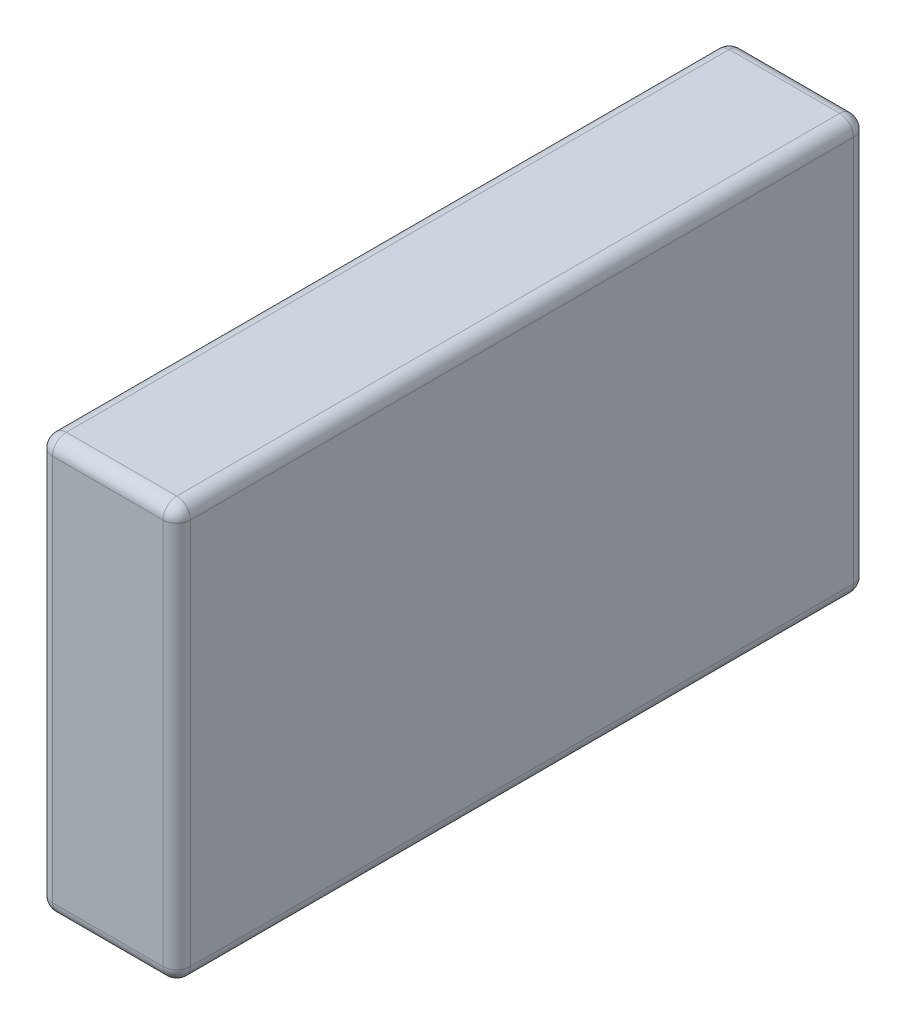
ISO-10303-21;
HEADER;
FILE_DESCRIPTION(('STEP AP214'),'2;1');
FILE_NAME('part.step','',(''),(''),'','','');
FILE_SCHEMA(('AUTOMOTIVE_DESIGN { 1 0 10303 214 1 1 1 1 }'));
ENDSEC;
DATA;
#1=APPLICATION_CONTEXT('core data for automotive mechanical design processes');
#2=APPLICATION_PROTOCOL_DEFINITION('international standard','automotive_design',2000,#1);
#3=PRODUCT_CONTEXT('',#1,'mechanical');
#4=PRODUCT('Part','Part','',(#3));
#5=PRODUCT_RELATED_PRODUCT_CATEGORY('part','',(#4));
#6=PRODUCT_DEFINITION_FORMATION('','',#4);
#7=PRODUCT_DEFINITION_CONTEXT('part definition',#1,'design');
#8=PRODUCT_DEFINITION('design','',#6,#7);
#9=PRODUCT_DEFINITION_SHAPE('','',#8);
#10=(LENGTH_UNIT() NAMED_UNIT(*) SI_UNIT(.MILLI.,.METRE.));
#11=(NAMED_UNIT(*) PLANE_ANGLE_UNIT() SI_UNIT($,.RADIAN.));
#12=(NAMED_UNIT(*) SI_UNIT($,.STERADIAN.) SOLID_ANGLE_UNIT());
#13=UNCERTAINTY_MEASURE_WITH_UNIT(LENGTH_MEASURE(1.E-05),#10,'distance_accuracy_value','');
#14=(GEOMETRIC_REPRESENTATION_CONTEXT(3) GLOBAL_UNCERTAINTY_ASSIGNED_CONTEXT((#13)) GLOBAL_UNIT_ASSIGNED_CONTEXT((#10,
#11,#12)) REPRESENTATION_CONTEXT('',''));
#15=CARTESIAN_POINT('',(0.,0.,0.));
#16=DIRECTION('',(0.,0.,1.));
#17=DIRECTION('',(1.,0.,0.));
#18=AXIS2_PLACEMENT_3D('',#15,#16,#17);
#19=CARTESIAN_POINT('',(-4.69017094017094,2.05128205128205,50.));
#20=DIRECTION('',(1.,0.,0.));
#21=DIRECTION('',(0.,1.,0.));
#22=AXIS2_PLACEMENT_3D('',#19,#20,#21);
#23=PLANE('',#22);
#24=DIRECTION('',(0.,0.,-1.));
#25=VECTOR('',#24,1.);
#26=CARTESIAN_POINT('',(-4.69017094017094,-26.9487179487179,50.));
#27=LINE('',#26,#25);
#28=CARTESIAN_POINT('',(-4.69017094017094,-26.9487179487179,1.));
#29=VERTEX_POINT('',#28);
#30=CARTESIAN_POINT('',(-4.69017094017094,-26.9487179487179,49.));
#31=VERTEX_POINT('',#30);
#32=EDGE_CURVE('E261',#29,#31,#27,.F.);
#33=ORIENTED_EDGE('',*,*,#32,.T.);
#34=DIRECTION('',(0.,-1.,0.));
#35=VECTOR('',#34,1.);
#36=CARTESIAN_POINT('',(-4.69017094017094,2.05128205128205,49.));
#37=LINE('',#36,#35);
#38=CARTESIAN_POINT('',(-4.69017094017094,1.05128205128205,49.));
#39=VERTEX_POINT('',#38);
#40=EDGE_CURVE('E259',#31,#39,#37,.F.);
#41=ORIENTED_EDGE('',*,*,#40,.T.);
#42=DIRECTION('',(0.,0.,-1.));
#43=VECTOR('',#42,1.);
#44=CARTESIAN_POINT('',(-4.69017094017094,1.05128205128205,50.));
#45=LINE('',#44,#43);
#46=CARTESIAN_POINT('',(-4.69017094017094,1.05128205128205,1.));
#47=VERTEX_POINT('',#46);
#48=EDGE_CURVE('E251',#39,#47,#45,.T.);
#49=ORIENTED_EDGE('',*,*,#48,.T.);
#50=DIRECTION('',(0.,-1.,0.));
#51=VECTOR('',#50,1.);
#52=CARTESIAN_POINT('',(-4.69017094017094,2.05128205128205,1.));
#53=LINE('',#52,#51);
#54=EDGE_CURVE('E256',#47,#29,#53,.T.);
#55=ORIENTED_EDGE('',*,*,#54,.T.);
#56=EDGE_LOOP('',(#33,#41,#49,#55));
#57=FACE_BOUND('',#56,.T.);
#58=ADVANCED_FACE('F32',(#57),#23,.F.);
#59=CARTESIAN_POINT('',(-4.69017094017094,-27.9487179487179,50.));
#60=DIRECTION('',(0.,1.,0.));
#61=DIRECTION('',(0.,0.,1.));
#62=AXIS2_PLACEMENT_3D('',#59,#60,#61);
#63=PLANE('',#62);
#64=DIRECTION('',(1.,0.,0.));
#65=VECTOR('',#64,1.);
#66=CARTESIAN_POINT('',(-4.69017094017094,-27.9487179487179,49.));
#67=LINE('',#66,#65);
#68=CARTESIAN_POINT('',(4.30982905982906,-27.9487179487179,49.));
#69=VERTEX_POINT('',#68);
#70=CARTESIAN_POINT('',(-3.69017094017094,-27.9487179487179,49.));
#71=VERTEX_POINT('',#70);
#72=EDGE_CURVE('E155',#69,#71,#67,.F.);
#73=ORIENTED_EDGE('',*,*,#72,.T.);
#74=DIRECTION('',(0.,0.,-1.));
#75=VECTOR('',#74,1.);
#76=CARTESIAN_POINT('',(-3.69017094017094,-27.9487179487179,50.));
#77=LINE('',#76,#75);
#78=CARTESIAN_POINT('',(-3.69017094017094,-27.9487179487179,1.));
#79=VERTEX_POINT('',#78);
#80=EDGE_CURVE('E274',#71,#79,#77,.T.);
#81=ORIENTED_EDGE('',*,*,#80,.T.);
#82=DIRECTION('',(1.,0.,0.));
#83=VECTOR('',#82,1.);
#84=CARTESIAN_POINT('',(-4.69017094017094,-27.9487179487179,1.));
#85=LINE('',#84,#83);
#86=CARTESIAN_POINT('',(4.30982905982906,-27.9487179487179,1.));
#87=VERTEX_POINT('',#86);
#88=EDGE_CURVE('E267',#79,#87,#85,.T.);
#89=ORIENTED_EDGE('',*,*,#88,.T.);
#90=DIRECTION('',(0.,0.,-1.));
#91=VECTOR('',#90,1.);
#92=CARTESIAN_POINT('',(4.30982905982906,-27.9487179487179,50.));
#93=LINE('',#92,#91);
#94=EDGE_CURVE('E265',#87,#69,#93,.F.);
#95=ORIENTED_EDGE('',*,*,#94,.T.);
#96=EDGE_LOOP('',(#73,#81,#89,#95));
#97=FACE_BOUND('',#96,.T.);
#98=ADVANCED_FACE('F316',(#97),#63,.F.);
#99=CARTESIAN_POINT('',(5.30982905982906,2.05128205128205,50.));
#100=DIRECTION('',(-1.,0.,0.));
#101=DIRECTION('',(0.,-1.,0.));
#102=AXIS2_PLACEMENT_3D('',#99,#100,#101);
#103=PLANE('',#102);
#104=DIRECTION('',(0.,1.,0.));
#105=VECTOR('',#104,1.);
#106=CARTESIAN_POINT('',(5.30982905982906,-27.9487179487179,49.));
#107=LINE('',#106,#105);
#108=CARTESIAN_POINT('',(5.30982905982906,1.05128205128205,49.));
#109=VERTEX_POINT('',#108);
#110=CARTESIAN_POINT('',(5.30982905982906,-26.9487179487179,49.));
#111=VERTEX_POINT('',#110);
#112=EDGE_CURVE('E56',#109,#111,#107,.F.);
#113=ORIENTED_EDGE('',*,*,#112,.T.);
#114=DIRECTION('',(0.,0.,-1.));
#115=VECTOR('',#114,1.);
#116=CARTESIAN_POINT('',(5.30982905982906,-26.9487179487179,50.));
#117=LINE('',#116,#115);
#118=CARTESIAN_POINT('',(5.30982905982906,-26.9487179487179,1.));
#119=VERTEX_POINT('',#118);
#120=EDGE_CURVE('E11',#111,#119,#117,.T.);
#121=ORIENTED_EDGE('',*,*,#120,.T.);
#122=DIRECTION('',(0.,1.,0.));
#123=VECTOR('',#122,1.);
#124=CARTESIAN_POINT('',(5.30982905982906,2.05128205128205,1.));
#125=LINE('',#124,#123);
#126=CARTESIAN_POINT('',(5.30982905982906,1.05128205128205,1.));
#127=VERTEX_POINT('',#126);
#128=EDGE_CURVE('E41',#119,#127,#125,.T.);
#129=ORIENTED_EDGE('',*,*,#128,.T.);
#130=DIRECTION('',(0.,0.,-1.));
#131=VECTOR('',#130,1.);
#132=CARTESIAN_POINT('',(5.30982905982906,1.05128205128205,50.));
#133=LINE('',#132,#131);
#134=EDGE_CURVE('E221',#127,#109,#133,.F.);
#135=ORIENTED_EDGE('',*,*,#134,.T.);
#136=EDGE_LOOP('',(#113,#121,#129,#135));
#137=FACE_BOUND('',#136,.T.);
#138=ADVANCED_FACE('F288',(#137),#103,.F.);
#139=CARTESIAN_POINT('',(-4.69017094017094,2.05128205128205,50.));
#140=DIRECTION('',(0.,-1.,0.));
#141=DIRECTION('',(0.,0.,-1.));
#142=AXIS2_PLACEMENT_3D('',#139,#140,#141);
#143=PLANE('',#142);
#144=DIRECTION('',(-1.,0.,0.));
#145=VECTOR('',#144,1.);
#146=CARTESIAN_POINT('',(-4.69017094017094,2.05128205128205,1.));
#147=LINE('',#146,#145);
#148=CARTESIAN_POINT('',(4.30982905982906,2.05128205128205,1.));
#149=VERTEX_POINT('',#148);
#150=CARTESIAN_POINT('',(-3.69017094017094,2.05128205128205,1.));
#151=VERTEX_POINT('',#150);
#152=EDGE_CURVE('E214',#149,#151,#147,.T.);
#153=ORIENTED_EDGE('',*,*,#152,.T.);
#154=DIRECTION('',(0.,0.,-1.));
#155=VECTOR('',#154,1.);
#156=CARTESIAN_POINT('',(-3.69017094017094,2.05128205128205,50.));
#157=LINE('',#156,#155);
#158=CARTESIAN_POINT('',(-3.69017094017094,2.05128205128205,49.));
#159=VERTEX_POINT('',#158);
#160=EDGE_CURVE('E218',#151,#159,#157,.F.);
#161=ORIENTED_EDGE('',*,*,#160,.T.);
#162=DIRECTION('',(-1.,0.,0.));
#163=VECTOR('',#162,1.);
#164=CARTESIAN_POINT('',(5.30982905982906,2.05128205128205,49.));
#165=LINE('',#164,#163);
#166=CARTESIAN_POINT('',(4.30982905982906,2.05128205128205,49.));
#167=VERTEX_POINT('',#166);
#168=EDGE_CURVE('E219',#159,#167,#165,.F.);
#169=ORIENTED_EDGE('',*,*,#168,.T.);
#170=DIRECTION('',(0.,0.,-1.));
#171=VECTOR('',#170,1.);
#172=CARTESIAN_POINT('',(4.30982905982906,2.05128205128205,50.));
#173=LINE('',#172,#171);
#174=EDGE_CURVE('E223',#167,#149,#173,.T.);
#175=ORIENTED_EDGE('',*,*,#174,.T.);
#176=EDGE_LOOP('',(#153,#161,#169,#175));
#177=FACE_BOUND('',#176,.T.);
#178=ADVANCED_FACE('F284',(#177),#143,.F.);
#179=CARTESIAN_POINT('',(0.,0.,50.));
#180=DIRECTION('',(0.,0.,1.));
#181=DIRECTION('',(1.,0.,0.));
#182=AXIS2_PLACEMENT_3D('',#179,#180,#181);
#183=PLANE('',#182);
#184=DIRECTION('',(-1.,0.,0.));
#185=VECTOR('',#184,1.);
#186=CARTESIAN_POINT('',(-4.69017094017094,1.05128205128205,50.));
#187=LINE('',#186,#185);
#188=CARTESIAN_POINT('',(4.30982905982906,1.05128205128205,50.));
#189=VERTEX_POINT('',#188);
#190=CARTESIAN_POINT('',(-3.69017094017094,1.05128205128205,50.));
#191=VERTEX_POINT('',#190);
#192=EDGE_CURVE('E134',#189,#191,#187,.T.);
#193=ORIENTED_EDGE('',*,*,#192,.T.);
#194=DIRECTION('',(0.,-1.,0.));
#195=VECTOR('',#194,1.);
#196=CARTESIAN_POINT('',(-3.69017094017094,-27.9487179487179,50.));
#197=LINE('',#196,#195);
#198=CARTESIAN_POINT('',(-3.69017094017094,-26.9487179487179,50.));
#199=VERTEX_POINT('',#198);
#200=EDGE_CURVE('E130',#191,#199,#197,.T.);
#201=ORIENTED_EDGE('',*,*,#200,.T.);
#202=DIRECTION('',(1.,0.,0.));
#203=VECTOR('',#202,1.);
#204=CARTESIAN_POINT('',(5.30982905982906,-26.9487179487179,50.));
#205=LINE('',#204,#203);
#206=CARTESIAN_POINT('',(4.30982905982906,-26.9487179487179,50.));
#207=VERTEX_POINT('',#206);
#208=EDGE_CURVE('E124',#199,#207,#205,.T.);
#209=ORIENTED_EDGE('',*,*,#208,.T.);
#210=DIRECTION('',(0.,1.,0.));
#211=VECTOR('',#210,1.);
#212=CARTESIAN_POINT('',(4.30982905982906,2.05128205128205,50.));
#213=LINE('',#212,#211);
#214=EDGE_CURVE('E127',#207,#189,#213,.T.);
#215=ORIENTED_EDGE('',*,*,#214,.T.);
#216=EDGE_LOOP('',(#193,#201,#209,#215));
#217=FACE_BOUND('',#216,.T.);
#218=ADVANCED_FACE('F126',(#217),#183,.T.);
#219=CARTESIAN_POINT('',(0.,0.,0.));
#220=DIRECTION('',(0.,0.,1.));
#221=DIRECTION('',(1.,0.,0.));
#222=AXIS2_PLACEMENT_3D('',#219,#220,#221);
#223=PLANE('',#222);
#224=DIRECTION('',(1.,0.,0.));
#225=VECTOR('',#224,1.);
#226=CARTESIAN_POINT('',(0.,-26.9487179487179,0.));
#227=LINE('',#226,#225);
#228=CARTESIAN_POINT('',(4.30982905982906,-26.9487179487179,0.));
#229=VERTEX_POINT('',#228);
#230=CARTESIAN_POINT('',(-3.69017094017094,-26.9487179487179,0.));
#231=VERTEX_POINT('',#230);
#232=EDGE_CURVE('E279',#229,#231,#227,.F.);
#233=ORIENTED_EDGE('',*,*,#232,.T.);
#234=DIRECTION('',(0.,-1.,0.));
#235=VECTOR('',#234,1.);
#236=CARTESIAN_POINT('',(-3.69017094017094,0.,0.));
#237=LINE('',#236,#235);
#238=CARTESIAN_POINT('',(-3.69017094017094,1.05128205128205,0.));
#239=VERTEX_POINT('',#238);
#240=EDGE_CURVE('E282',#231,#239,#237,.F.);
#241=ORIENTED_EDGE('',*,*,#240,.T.);
#242=DIRECTION('',(-1.,0.,0.));
#243=VECTOR('',#242,1.);
#244=CARTESIAN_POINT('',(0.,1.05128205128205,0.));
#245=LINE('',#244,#243);
#246=CARTESIAN_POINT('',(4.30982905982906,1.05128205128205,0.));
#247=VERTEX_POINT('',#246);
#248=EDGE_CURVE('E212',#239,#247,#245,.F.);
#249=ORIENTED_EDGE('',*,*,#248,.T.);
#250=DIRECTION('',(0.,1.,0.));
#251=VECTOR('',#250,1.);
#252=CARTESIAN_POINT('',(4.30982905982906,0.,0.));
#253=LINE('',#252,#251);
#254=EDGE_CURVE('E277',#247,#229,#253,.F.);
#255=ORIENTED_EDGE('',*,*,#254,.T.);
#256=EDGE_LOOP('',(#233,#241,#249,#255));
#257=FACE_BOUND('',#256,.T.);
#258=ADVANCED_FACE('F297',(#257),#223,.F.);
#259=CARTESIAN_POINT('',(4.30982905982906,2.05128205128205,1.));
#260=DIRECTION('',(0.,1.,0.));
#261=DIRECTION('',(-1.,0.,0.));
#262=AXIS2_PLACEMENT_3D('',#259,#260,#261);
#263=CYLINDRICAL_SURFACE('',#262,1.);
#264=CARTESIAN_POINT('',(4.30982905982906,1.05128205128205,1.));
#265=DIRECTION('',(0.,1.,0.));
#266=DIRECTION('',(0.,0.,1.));
#267=AXIS2_PLACEMENT_3D('',#264,#265,#266);
#268=CIRCLE('',#267,1.);
#269=EDGE_CURVE('E36',#127,#247,#268,.T.);
#270=ORIENTED_EDGE('',*,*,#269,.F.);
#271=ORIENTED_EDGE('',*,*,#128,.F.);
#272=CARTESIAN_POINT('',(4.30982905982906,-26.9487179487179,1.));
#273=DIRECTION('',(0.,-1.,0.));
#274=DIRECTION('',(0.,0.,-1.));
#275=AXIS2_PLACEMENT_3D('',#272,#273,#274);
#276=CIRCLE('',#275,1.);
#277=EDGE_CURVE('E193',#229,#119,#276,.T.);
#278=ORIENTED_EDGE('',*,*,#277,.F.);
#279=ORIENTED_EDGE('',*,*,#254,.F.);
#280=EDGE_LOOP('',(#270,#271,#278,#279));
#281=FACE_BOUND('',#280,.T.);
#282=ADVANCED_FACE('F34',(#281),#263,.T.);
#283=CARTESIAN_POINT('',(4.30982905982906,1.05128205128205,1.));
#284=DIRECTION('',(0.,0.,1.));
#285=DIRECTION('',(1.,0.,0.));
#286=AXIS2_PLACEMENT_3D('',#283,#284,#285);
#287=SPHERICAL_SURFACE('',#286,1.);
#288=CARTESIAN_POINT('',(4.30982905982906,1.05128205128205,1.));
#289=DIRECTION('',(0.,0.,-1.));
#290=DIRECTION('',(-1.,0.,0.));
#291=AXIS2_PLACEMENT_3D('',#288,#289,#290);
#292=CIRCLE('',#291,1.);
#293=EDGE_CURVE('E188',#127,#149,#292,.F.);
#294=ORIENTED_EDGE('',*,*,#293,.F.);
#295=ORIENTED_EDGE('',*,*,#269,.T.);
#296=CARTESIAN_POINT('',(4.30982905982906,1.05128205128205,1.));
#297=DIRECTION('',(1.,0.,0.));
#298=DIRECTION('',(0.,1.,0.));
#299=AXIS2_PLACEMENT_3D('',#296,#297,#298);
#300=CIRCLE('',#299,1.);
#301=EDGE_CURVE('E191',#149,#247,#300,.F.);
#302=ORIENTED_EDGE('',*,*,#301,.F.);
#303=EDGE_LOOP('',(#294,#295,#302));
#304=FACE_BOUND('',#303,.T.);
#305=ADVANCED_FACE('F203',(#304),#287,.T.);
#306=CARTESIAN_POINT('',(4.30982905982906,-26.9487179487179,1.));
#307=DIRECTION('',(0.,0.,1.));
#308=DIRECTION('',(1.,0.,0.));
#309=AXIS2_PLACEMENT_3D('',#306,#307,#308);
#310=SPHERICAL_SURFACE('',#309,1.);
#311=CARTESIAN_POINT('',(4.30982905982906,-26.9487179487179,1.));
#312=DIRECTION('',(1.,0.,0.));
#313=DIRECTION('',(0.,0.,-1.));
#314=AXIS2_PLACEMENT_3D('',#311,#312,#313);
#315=CIRCLE('',#314,1.);
#316=EDGE_CURVE('E184',#229,#87,#315,.F.);
#317=ORIENTED_EDGE('',*,*,#316,.F.);
#318=ORIENTED_EDGE('',*,*,#277,.T.);
#319=CARTESIAN_POINT('',(4.30982905982906,-26.9487179487179,1.));
#320=DIRECTION('',(0.,0.,-1.));
#321=DIRECTION('',(-1.,0.,0.));
#322=AXIS2_PLACEMENT_3D('',#319,#320,#321);
#323=CIRCLE('',#322,1.);
#324=EDGE_CURVE('E49',#87,#119,#323,.F.);
#325=ORIENTED_EDGE('',*,*,#324,.F.);
#326=EDGE_LOOP('',(#317,#318,#325));
#327=FACE_BOUND('',#326,.T.);
#328=ADVANCED_FACE('F290',(#327),#310,.T.);
#329=CARTESIAN_POINT('',(-4.69017094017094,1.05128205128205,1.));
#330=DIRECTION('',(-1.,0.,0.));
#331=DIRECTION('',(0.,0.,1.));
#332=AXIS2_PLACEMENT_3D('',#329,#330,#331);
#333=CYLINDRICAL_SURFACE('',#332,1.);
#334=ORIENTED_EDGE('',*,*,#301,.T.);
#335=ORIENTED_EDGE('',*,*,#248,.F.);
#336=CARTESIAN_POINT('',(-3.69017094017094,1.05128205128205,1.));
#337=DIRECTION('',(-1.,0.,0.));
#338=DIRECTION('',(0.,0.,1.));
#339=AXIS2_PLACEMENT_3D('',#336,#337,#338);
#340=CIRCLE('',#339,1.);
#341=EDGE_CURVE('E179',#151,#239,#340,.T.);
#342=ORIENTED_EDGE('',*,*,#341,.F.);
#343=ORIENTED_EDGE('',*,*,#152,.F.);
#344=EDGE_LOOP('',(#334,#335,#342,#343));
#345=FACE_BOUND('',#344,.T.);
#346=ADVANCED_FACE('F210',(#345),#333,.T.);
#347=CARTESIAN_POINT('',(4.30982905982906,1.05128205128205,50.));
#348=DIRECTION('',(0.,0.,-1.));
#349=DIRECTION('',(-1.,0.,0.));
#350=AXIS2_PLACEMENT_3D('',#347,#348,#349);
#351=CYLINDRICAL_SURFACE('',#350,1.);
#352=ORIENTED_EDGE('',*,*,#293,.T.);
#353=ORIENTED_EDGE('',*,*,#174,.F.);
#354=CARTESIAN_POINT('',(4.30982905982906,1.05128205128205,49.));
#355=DIRECTION('',(0.,0.,1.));
#356=DIRECTION('',(1.,0.,0.));
#357=AXIS2_PLACEMENT_3D('',#354,#355,#356);
#358=CIRCLE('',#357,1.);
#359=EDGE_CURVE('E176',#109,#167,#358,.T.);
#360=ORIENTED_EDGE('',*,*,#359,.F.);
#361=ORIENTED_EDGE('',*,*,#134,.F.);
#362=EDGE_LOOP('',(#352,#353,#360,#361));
#363=FACE_BOUND('',#362,.T.);
#364=ADVANCED_FACE('F287',(#363),#351,.T.);
#365=CARTESIAN_POINT('',(4.30982905982906,0.,49.));
#366=DIRECTION('',(0.,-1.,0.));
#367=DIRECTION('',(1.,0.,0.));
#368=AXIS2_PLACEMENT_3D('',#365,#366,#367);
#369=CYLINDRICAL_SURFACE('',#368,1.);
#370=CARTESIAN_POINT('',(4.30982905982906,-26.9487179487179,49.));
#371=DIRECTION('',(0.,-1.,0.));
#372=DIRECTION('',(0.,0.,-1.));
#373=AXIS2_PLACEMENT_3D('',#370,#371,#372);
#374=CIRCLE('',#373,1.);
#375=EDGE_CURVE('E140',#111,#207,#374,.T.);
#376=ORIENTED_EDGE('',*,*,#375,.F.);
#377=ORIENTED_EDGE('',*,*,#112,.F.);
#378=CARTESIAN_POINT('',(4.30982905982906,1.05128205128205,49.));
#379=DIRECTION('',(0.,1.,0.));
#380=DIRECTION('',(0.,0.,1.));
#381=AXIS2_PLACEMENT_3D('',#378,#379,#380);
#382=CIRCLE('',#381,1.);
#383=EDGE_CURVE('E143',#189,#109,#382,.T.);
#384=ORIENTED_EDGE('',*,*,#383,.F.);
#385=ORIENTED_EDGE('',*,*,#214,.F.);
#386=EDGE_LOOP('',(#376,#377,#384,#385));
#387=FACE_BOUND('',#386,.T.);
#388=ADVANCED_FACE('F139',(#387),#369,.T.);
#389=CARTESIAN_POINT('',(4.30982905982906,-26.9487179487179,50.));
#390=DIRECTION('',(0.,0.,-1.));
#391=DIRECTION('',(-1.,0.,0.));
#392=AXIS2_PLACEMENT_3D('',#389,#390,#391);
#393=CYLINDRICAL_SURFACE('',#392,1.);
#394=ORIENTED_EDGE('',*,*,#324,.T.);
#395=ORIENTED_EDGE('',*,*,#120,.F.);
#396=CARTESIAN_POINT('',(4.30982905982906,-26.9487179487179,49.));
#397=DIRECTION('',(0.,0.,1.));
#398=DIRECTION('',(1.,0.,0.));
#399=AXIS2_PLACEMENT_3D('',#396,#397,#398);
#400=CIRCLE('',#399,1.);
#401=EDGE_CURVE('E152',#69,#111,#400,.T.);
#402=ORIENTED_EDGE('',*,*,#401,.F.);
#403=ORIENTED_EDGE('',*,*,#94,.F.);
#404=EDGE_LOOP('',(#394,#395,#402,#403));
#405=FACE_BOUND('',#404,.T.);
#406=ADVANCED_FACE('F426',(#405),#393,.T.);
#407=CARTESIAN_POINT('',(-4.69017094017094,-26.9487179487179,1.));
#408=DIRECTION('',(1.,0.,0.));
#409=DIRECTION('',(0.,0.,-1.));
#410=AXIS2_PLACEMENT_3D('',#407,#408,#409);
#411=CYLINDRICAL_SURFACE('',#410,1.);
#412=ORIENTED_EDGE('',*,*,#316,.T.);
#413=ORIENTED_EDGE('',*,*,#88,.F.);
#414=CARTESIAN_POINT('',(-3.69017094017094,-26.9487179487179,1.));
#415=DIRECTION('',(-1.,0.,0.));
#416=DIRECTION('',(0.,0.,1.));
#417=AXIS2_PLACEMENT_3D('',#414,#415,#416);
#418=CIRCLE('',#417,1.);
#419=EDGE_CURVE('E171',#231,#79,#418,.T.);
#420=ORIENTED_EDGE('',*,*,#419,.F.);
#421=ORIENTED_EDGE('',*,*,#232,.F.);
#422=EDGE_LOOP('',(#412,#413,#420,#421));
#423=FACE_BOUND('',#422,.T.);
#424=ADVANCED_FACE('F294',(#423),#411,.T.);
#425=CARTESIAN_POINT('',(-3.69017094017094,2.05128205128205,1.));
#426=DIRECTION('',(0.,-1.,0.));
#427=DIRECTION('',(1.,0.,0.));
#428=AXIS2_PLACEMENT_3D('',#425,#426,#427);
#429=CYLINDRICAL_SURFACE('',#428,1.);
#430=CARTESIAN_POINT('',(-3.69017094017094,1.05128205128205,1.));
#431=DIRECTION('',(0.,1.,0.));
#432=DIRECTION('',(-1.,0.,0.));
#433=AXIS2_PLACEMENT_3D('',#430,#431,#432);
#434=CIRCLE('',#433,1.);
#435=EDGE_CURVE('E181',#239,#47,#434,.T.);
#436=ORIENTED_EDGE('',*,*,#435,.F.);
#437=ORIENTED_EDGE('',*,*,#240,.F.);
#438=CARTESIAN_POINT('',(-3.69017094017094,-26.9487179487179,1.));
#439=DIRECTION('',(0.,-1.,0.));
#440=DIRECTION('',(0.,0.,-1.));
#441=AXIS2_PLACEMENT_3D('',#438,#439,#440);
#442=CIRCLE('',#441,1.);
#443=EDGE_CURVE('E168',#29,#231,#442,.T.);
#444=ORIENTED_EDGE('',*,*,#443,.F.);
#445=ORIENTED_EDGE('',*,*,#54,.F.);
#446=EDGE_LOOP('',(#436,#437,#444,#445));
#447=FACE_BOUND('',#446,.T.);
#448=ADVANCED_FACE('F301',(#447),#429,.T.);
#449=CARTESIAN_POINT('',(-3.69017094017094,1.05128205128205,1.));
#450=DIRECTION('',(0.,0.,1.));
#451=DIRECTION('',(1.,0.,0.));
#452=AXIS2_PLACEMENT_3D('',#449,#450,#451);
#453=SPHERICAL_SURFACE('',#452,1.);
#454=ORIENTED_EDGE('',*,*,#341,.T.);
#455=ORIENTED_EDGE('',*,*,#435,.T.);
#456=CARTESIAN_POINT('',(-3.69017094017094,1.05128205128205,1.));
#457=DIRECTION('',(0.,0.,-1.));
#458=DIRECTION('',(-1.,0.,0.));
#459=AXIS2_PLACEMENT_3D('',#456,#457,#458);
#460=CIRCLE('',#459,1.);
#461=EDGE_CURVE('E160',#151,#47,#460,.F.);
#462=ORIENTED_EDGE('',*,*,#461,.F.);
#463=EDGE_LOOP('',(#454,#455,#462));
#464=FACE_BOUND('',#463,.T.);
#465=ADVANCED_FACE('F304',(#464),#453,.T.);
#466=CARTESIAN_POINT('',(4.30982905982906,1.05128205128205,49.));
#467=DIRECTION('',(0.,0.,1.));
#468=DIRECTION('',(1.,0.,0.));
#469=AXIS2_PLACEMENT_3D('',#466,#467,#468);
#470=SPHERICAL_SURFACE('',#469,1.);
#471=ORIENTED_EDGE('',*,*,#383,.T.);
#472=ORIENTED_EDGE('',*,*,#359,.T.);
#473=CARTESIAN_POINT('',(4.30982905982906,1.05128205128205,49.));
#474=DIRECTION('',(1.,0.,0.));
#475=DIRECTION('',(0.,0.,-1.));
#476=AXIS2_PLACEMENT_3D('',#473,#474,#475);
#477=CIRCLE('',#476,1.);
#478=EDGE_CURVE('E156',#189,#167,#477,.F.);
#479=ORIENTED_EDGE('',*,*,#478,.F.);
#480=EDGE_LOOP('',(#471,#472,#479));
#481=FACE_BOUND('',#480,.T.);
#482=ADVANCED_FACE('F306',(#481),#470,.T.);
#483=CARTESIAN_POINT('',(4.30982905982906,-26.9487179487179,49.));
#484=DIRECTION('',(0.,0.,1.));
#485=DIRECTION('',(1.,0.,0.));
#486=AXIS2_PLACEMENT_3D('',#483,#484,#485);
#487=SPHERICAL_SURFACE('',#486,1.);
#488=ORIENTED_EDGE('',*,*,#401,.T.);
#489=ORIENTED_EDGE('',*,*,#375,.T.);
#490=CARTESIAN_POINT('',(4.30982905982906,-26.9487179487179,49.));
#491=DIRECTION('',(1.,0.,0.));
#492=DIRECTION('',(0.,0.,-1.));
#493=AXIS2_PLACEMENT_3D('',#490,#491,#492);
#494=CIRCLE('',#493,1.);
#495=EDGE_CURVE('E149',#69,#207,#494,.F.);
#496=ORIENTED_EDGE('',*,*,#495,.F.);
#497=EDGE_LOOP('',(#488,#489,#496));
#498=FACE_BOUND('',#497,.T.);
#499=ADVANCED_FACE('F148',(#498),#487,.T.);
#500=CARTESIAN_POINT('',(-3.69017094017094,-26.9487179487179,1.));
#501=DIRECTION('',(0.,0.,1.));
#502=DIRECTION('',(1.,0.,0.));
#503=AXIS2_PLACEMENT_3D('',#500,#501,#502);
#504=SPHERICAL_SURFACE('',#503,1.);
#505=ORIENTED_EDGE('',*,*,#443,.T.);
#506=ORIENTED_EDGE('',*,*,#419,.T.);
#507=CARTESIAN_POINT('',(-3.69017094017094,-26.9487179487179,1.));
#508=DIRECTION('',(0.,0.,-1.));
#509=DIRECTION('',(-1.,0.,0.));
#510=AXIS2_PLACEMENT_3D('',#507,#508,#509);
#511=CIRCLE('',#510,1.);
#512=EDGE_CURVE('E157',#29,#79,#511,.F.);
#513=ORIENTED_EDGE('',*,*,#512,.F.);
#514=EDGE_LOOP('',(#505,#506,#513));
#515=FACE_BOUND('',#514,.T.);
#516=ADVANCED_FACE('F346',(#515),#504,.T.);
#517=CARTESIAN_POINT('',(-3.69017094017094,1.05128205128205,50.));
#518=DIRECTION('',(0.,0.,-1.));
#519=DIRECTION('',(-1.,0.,0.));
#520=AXIS2_PLACEMENT_3D('',#517,#518,#519);
#521=CYLINDRICAL_SURFACE('',#520,1.);
#522=ORIENTED_EDGE('',*,*,#461,.T.);
#523=ORIENTED_EDGE('',*,*,#48,.F.);
#524=CARTESIAN_POINT('',(-3.69017094017094,1.05128205128205,49.));
#525=DIRECTION('',(0.,0.,1.));
#526=DIRECTION('',(1.,0.,0.));
#527=AXIS2_PLACEMENT_3D('',#524,#525,#526);
#528=CIRCLE('',#527,1.);
#529=EDGE_CURVE('E162',#159,#39,#528,.T.);
#530=ORIENTED_EDGE('',*,*,#529,.F.);
#531=ORIENTED_EDGE('',*,*,#160,.F.);
#532=EDGE_LOOP('',(#522,#523,#530,#531));
#533=FACE_BOUND('',#532,.T.);
#534=ADVANCED_FACE('F253',(#533),#521,.T.);
#535=CARTESIAN_POINT('',(0.,1.05128205128205,49.));
#536=DIRECTION('',(1.,0.,0.));
#537=DIRECTION('',(0.,0.,-1.));
#538=AXIS2_PLACEMENT_3D('',#535,#536,#537);
#539=CYLINDRICAL_SURFACE('',#538,1.);
#540=ORIENTED_EDGE('',*,*,#478,.T.);
#541=ORIENTED_EDGE('',*,*,#168,.F.);
#542=CARTESIAN_POINT('',(-3.69017094017094,1.05128205128205,49.));
#543=DIRECTION('',(-1.,0.,0.));
#544=DIRECTION('',(0.,0.,1.));
#545=AXIS2_PLACEMENT_3D('',#542,#543,#544);
#546=CIRCLE('',#545,1.);
#547=EDGE_CURVE('E240',#191,#159,#546,.T.);
#548=ORIENTED_EDGE('',*,*,#547,.F.);
#549=ORIENTED_EDGE('',*,*,#192,.F.);
#550=EDGE_LOOP('',(#540,#541,#548,#549));
#551=FACE_BOUND('',#550,.T.);
#552=ADVANCED_FACE('F340',(#551),#539,.T.);
#553=CARTESIAN_POINT('',(0.,-26.9487179487179,49.));
#554=DIRECTION('',(-1.,0.,0.));
#555=DIRECTION('',(0.,0.,1.));
#556=AXIS2_PLACEMENT_3D('',#553,#554,#555);
#557=CYLINDRICAL_SURFACE('',#556,1.);
#558=ORIENTED_EDGE('',*,*,#495,.T.);
#559=ORIENTED_EDGE('',*,*,#208,.F.);
#560=CARTESIAN_POINT('',(-3.69017094017094,-26.9487179487179,49.));
#561=DIRECTION('',(-1.,0.,0.));
#562=DIRECTION('',(0.,0.,1.));
#563=AXIS2_PLACEMENT_3D('',#560,#561,#562);
#564=CIRCLE('',#563,1.);
#565=EDGE_CURVE('E237',#71,#199,#564,.T.);
#566=ORIENTED_EDGE('',*,*,#565,.F.);
#567=ORIENTED_EDGE('',*,*,#72,.F.);
#568=EDGE_LOOP('',(#558,#559,#566,#567));
#569=FACE_BOUND('',#568,.T.);
#570=ADVANCED_FACE('F154',(#569),#557,.T.);
#571=CARTESIAN_POINT('',(-3.69017094017094,-26.9487179487179,50.));
#572=DIRECTION('',(0.,0.,-1.));
#573=DIRECTION('',(-1.,0.,0.));
#574=AXIS2_PLACEMENT_3D('',#571,#572,#573);
#575=CYLINDRICAL_SURFACE('',#574,1.);
#576=ORIENTED_EDGE('',*,*,#512,.T.);
#577=ORIENTED_EDGE('',*,*,#80,.F.);
#578=CARTESIAN_POINT('',(-3.69017094017094,-26.9487179487179,49.));
#579=DIRECTION('',(0.,0.,1.));
#580=DIRECTION('',(1.,0.,0.));
#581=AXIS2_PLACEMENT_3D('',#578,#579,#580);
#582=CIRCLE('',#581,1.);
#583=EDGE_CURVE('E234',#31,#71,#582,.T.);
#584=ORIENTED_EDGE('',*,*,#583,.F.);
#585=ORIENTED_EDGE('',*,*,#32,.F.);
#586=EDGE_LOOP('',(#576,#577,#584,#585));
#587=FACE_BOUND('',#586,.T.);
#588=ADVANCED_FACE('F334',(#587),#575,.T.);
#589=CARTESIAN_POINT('',(-3.69017094017094,1.05128205128205,49.));
#590=DIRECTION('',(0.,0.,1.));
#591=DIRECTION('',(1.,0.,0.));
#592=AXIS2_PLACEMENT_3D('',#589,#590,#591);
#593=SPHERICAL_SURFACE('',#592,1.);
#594=ORIENTED_EDGE('',*,*,#547,.T.);
#595=ORIENTED_EDGE('',*,*,#529,.T.);
#596=CARTESIAN_POINT('',(-3.69017094017094,1.05128205128205,49.));
#597=DIRECTION('',(0.,1.,0.));
#598=DIRECTION('',(-1.,0.,0.));
#599=AXIS2_PLACEMENT_3D('',#596,#597,#598);
#600=CIRCLE('',#599,1.);
#601=EDGE_CURVE('E232',#191,#39,#600,.F.);
#602=ORIENTED_EDGE('',*,*,#601,.F.);
#603=EDGE_LOOP('',(#594,#595,#602));
#604=FACE_BOUND('',#603,.T.);
#605=ADVANCED_FACE('F246',(#604),#593,.T.);
#606=CARTESIAN_POINT('',(-3.69017094017094,-26.9487179487179,49.));
#607=DIRECTION('',(0.,0.,1.));
#608=DIRECTION('',(1.,0.,0.));
#609=AXIS2_PLACEMENT_3D('',#606,#607,#608);
#610=SPHERICAL_SURFACE('',#609,1.);
#611=ORIENTED_EDGE('',*,*,#583,.T.);
#612=ORIENTED_EDGE('',*,*,#565,.T.);
#613=CARTESIAN_POINT('',(-3.69017094017094,-26.9487179487179,49.));
#614=DIRECTION('',(0.,-1.,0.));
#615=DIRECTION('',(0.,0.,-1.));
#616=AXIS2_PLACEMENT_3D('',#613,#614,#615);
#617=CIRCLE('',#616,1.);
#618=EDGE_CURVE('E230',#31,#199,#617,.F.);
#619=ORIENTED_EDGE('',*,*,#618,.F.);
#620=EDGE_LOOP('',(#611,#612,#619));
#621=FACE_BOUND('',#620,.T.);
#622=ADVANCED_FACE('F328',(#621),#610,.T.);
#623=CARTESIAN_POINT('',(-3.69017094017094,0.,49.));
#624=DIRECTION('',(0.,1.,0.));
#625=DIRECTION('',(-1.,0.,0.));
#626=AXIS2_PLACEMENT_3D('',#623,#624,#625);
#627=CYLINDRICAL_SURFACE('',#626,1.);
#628=ORIENTED_EDGE('',*,*,#601,.T.);
#629=ORIENTED_EDGE('',*,*,#40,.F.);
#630=ORIENTED_EDGE('',*,*,#618,.T.);
#631=ORIENTED_EDGE('',*,*,#200,.F.);
#632=EDGE_LOOP('',(#628,#629,#630,#631));
#633=FACE_BOUND('',#632,.T.);
#634=ADVANCED_FACE('F325',(#633),#627,.T.);
#635=CLOSED_SHELL('',(#58,#98,#138,#178,#218,#258,#282,#305,#328,#346,#364,#388,#406,#424,#448,
#465,#482,#499,#516,#534,#552,#570,#588,#605,#622,#634));
#636=MANIFOLD_SOLID_BREP('B2',#635);
#637=ADVANCED_BREP_SHAPE_REPRESENTATION('',(#18,#636),#14);
#638=SHAPE_DEFINITION_REPRESENTATION(#9,#637);
ENDSEC;
END-ISO-10303-21;
